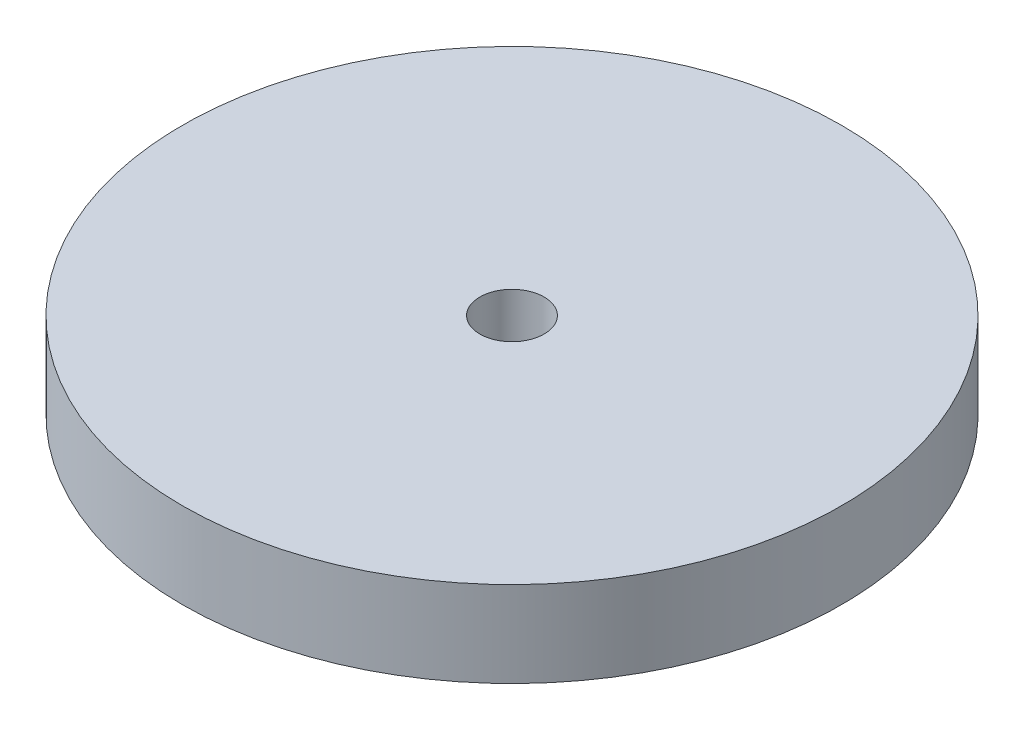
ISO-10303-21;
HEADER;
FILE_DESCRIPTION(('STEP AP214'),'2;1');
FILE_NAME('part.step','',(''),(''),'','','');
FILE_SCHEMA(('AUTOMOTIVE_DESIGN { 1 0 10303 214 1 1 1 1 }'));
ENDSEC;
DATA;
#1=APPLICATION_CONTEXT('core data for automotive mechanical design processes');
#2=APPLICATION_PROTOCOL_DEFINITION('international standard','automotive_design',2000,#1);
#3=PRODUCT_CONTEXT('',#1,'mechanical');
#4=PRODUCT('Part','Part','',(#3));
#5=PRODUCT_RELATED_PRODUCT_CATEGORY('part','',(#4));
#6=PRODUCT_DEFINITION_FORMATION('','',#4);
#7=PRODUCT_DEFINITION_CONTEXT('part definition',#1,'design');
#8=PRODUCT_DEFINITION('design','',#6,#7);
#9=PRODUCT_DEFINITION_SHAPE('','',#8);
#10=(LENGTH_UNIT() NAMED_UNIT(*) SI_UNIT(.MILLI.,.METRE.));
#11=(NAMED_UNIT(*) PLANE_ANGLE_UNIT() SI_UNIT($,.RADIAN.));
#12=(NAMED_UNIT(*) SI_UNIT($,.STERADIAN.) SOLID_ANGLE_UNIT());
#13=UNCERTAINTY_MEASURE_WITH_UNIT(LENGTH_MEASURE(1.E-05),#10,'distance_accuracy_value','');
#14=(GEOMETRIC_REPRESENTATION_CONTEXT(3) GLOBAL_UNCERTAINTY_ASSIGNED_CONTEXT((#13)) GLOBAL_UNIT_ASSIGNED_CONTEXT((#10,
#11,#12)) REPRESENTATION_CONTEXT('',''));
#15=CARTESIAN_POINT('',(0.,0.,0.));
#16=DIRECTION('',(0.,0.,1.));
#17=DIRECTION('',(1.,0.,0.));
#18=AXIS2_PLACEMENT_3D('',#15,#16,#17);
#19=CARTESIAN_POINT('',(0.,20.,0.));
#20=DIRECTION('',(0.,-1.,0.));
#21=DIRECTION('',(0.,0.,-1.));
#22=AXIS2_PLACEMENT_3D('',#19,#20,#21);
#23=CYLINDRICAL_SURFACE('',#22,76.895);
#24=CARTESIAN_POINT('',(0.,20.,0.));
#25=DIRECTION('',(0.,1.,0.));
#26=DIRECTION('',(0.,0.,1.));
#27=AXIS2_PLACEMENT_3D('',#24,#25,#26);
#28=CIRCLE('',#27,76.895);
#29=CARTESIAN_POINT('',(0.,20.,76.895));
#30=VERTEX_POINT('',#29);
#31=EDGE_CURVE('E10',#30,#30,#28,.T.);
#32=ORIENTED_EDGE('',*,*,#31,.F.);
#33=EDGE_LOOP('',(#32));
#34=FACE_BOUND('',#33,.T.);
#35=CARTESIAN_POINT('',(0.,0.,0.));
#36=DIRECTION('',(0.,1.,0.));
#37=DIRECTION('',(0.,0.,1.));
#38=AXIS2_PLACEMENT_3D('',#35,#36,#37);
#39=CIRCLE('',#38,76.895);
#40=CARTESIAN_POINT('',(0.,0.,76.895));
#41=VERTEX_POINT('',#40);
#42=EDGE_CURVE('E36',#41,#41,#39,.T.);
#43=ORIENTED_EDGE('',*,*,#42,.T.);
#44=EDGE_LOOP('',(#43));
#45=FACE_BOUND('',#44,.T.);
#46=ADVANCED_FACE('F33',(#34,#45),#23,.T.);
#47=CARTESIAN_POINT('',(0.,20.,0.));
#48=DIRECTION('',(0.,1.,0.));
#49=DIRECTION('',(0.,0.,1.));
#50=AXIS2_PLACEMENT_3D('',#47,#48,#49);
#51=PLANE('',#50);
#52=CARTESIAN_POINT('',(0.,20.,0.));
#53=DIRECTION('',(0.,1.,0.));
#54=DIRECTION('',(0.,0.,1.));
#55=AXIS2_PLACEMENT_3D('',#52,#53,#54);
#56=CIRCLE('',#55,7.5);
#57=CARTESIAN_POINT('',(0.,20.,7.5));
#58=VERTEX_POINT('',#57);
#59=EDGE_CURVE('E47',#58,#58,#56,.T.);
#60=ORIENTED_EDGE('',*,*,#59,.F.);
#61=EDGE_LOOP('',(#60));
#62=FACE_BOUND('',#61,.T.);
#63=ORIENTED_EDGE('',*,*,#31,.T.);
#64=EDGE_LOOP('',(#63));
#65=FACE_BOUND('',#64,.T.);
#66=ADVANCED_FACE('F54',(#62,#65),#51,.T.);
#67=CARTESIAN_POINT('',(0.,0.,0.));
#68=DIRECTION('',(0.,1.,0.));
#69=DIRECTION('',(0.,0.,1.));
#70=AXIS2_PLACEMENT_3D('',#67,#68,#69);
#71=PLANE('',#70);
#72=CARTESIAN_POINT('',(0.,0.,0.));
#73=DIRECTION('',(0.,1.,0.));
#74=DIRECTION('',(0.,0.,1.));
#75=AXIS2_PLACEMENT_3D('',#72,#73,#74);
#76=CIRCLE('',#75,7.5);
#77=CARTESIAN_POINT('',(0.,0.,7.5));
#78=VERTEX_POINT('',#77);
#79=EDGE_CURVE('E43',#78,#78,#76,.F.);
#80=ORIENTED_EDGE('',*,*,#79,.F.);
#81=EDGE_LOOP('',(#80));
#82=FACE_BOUND('',#81,.T.);
#83=ORIENTED_EDGE('',*,*,#42,.F.);
#84=EDGE_LOOP('',(#83));
#85=FACE_BOUND('',#84,.T.);
#86=ADVANCED_FACE('F56',(#82,#85),#71,.F.);
#87=CARTESIAN_POINT('',(0.,-0.001000000000001,0.));
#88=DIRECTION('',(0.,1.,0.));
#89=DIRECTION('',(0.,0.,1.));
#90=AXIS2_PLACEMENT_3D('',#87,#88,#89);
#91=CYLINDRICAL_SURFACE('',#90,7.5);
#92=ORIENTED_EDGE('',*,*,#59,.T.);
#93=EDGE_LOOP('',(#92));
#94=FACE_BOUND('',#93,.T.);
#95=ORIENTED_EDGE('',*,*,#79,.T.);
#96=EDGE_LOOP('',(#95));
#97=FACE_BOUND('',#96,.T.);
#98=ADVANCED_FACE('F51',(#94,#97),#91,.F.);
#99=CLOSED_SHELL('',(#46,#66,#86,#98));
#100=MANIFOLD_SOLID_BREP('B2',#99);
#101=ADVANCED_BREP_SHAPE_REPRESENTATION('',(#18,#100),#14);
#102=SHAPE_DEFINITION_REPRESENTATION(#9,#101);
ENDSEC;
END-ISO-10303-21;
